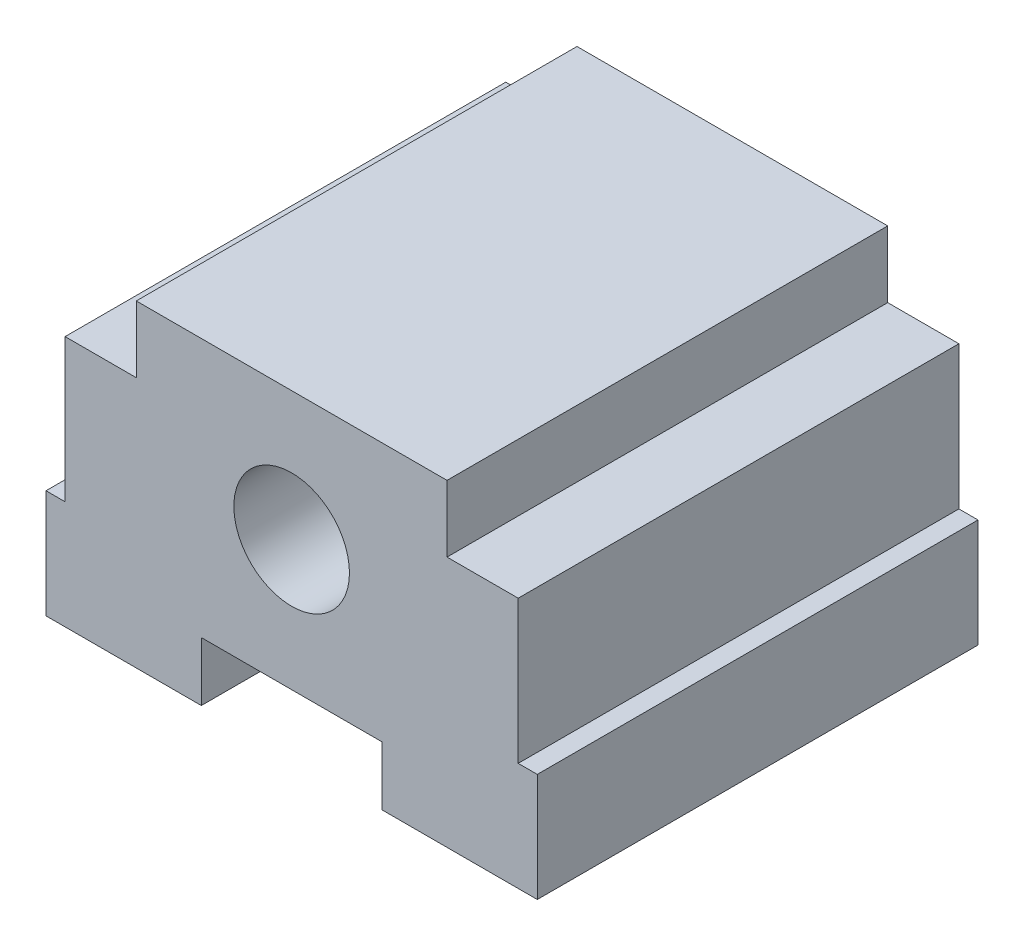
ISO-10303-21;
HEADER;
FILE_DESCRIPTION(('STEP AP214'),'2;1');
FILE_NAME('part.step','',(''),(''),'','','');
FILE_SCHEMA(('AUTOMOTIVE_DESIGN { 1 0 10303 214 1 1 1 1 }'));
ENDSEC;
DATA;
#1=APPLICATION_CONTEXT('core data for automotive mechanical design processes');
#2=APPLICATION_PROTOCOL_DEFINITION('international standard','automotive_design',2000,#1);
#3=PRODUCT_CONTEXT('',#1,'mechanical');
#4=PRODUCT('Part','Part','',(#3));
#5=PRODUCT_RELATED_PRODUCT_CATEGORY('part','',(#4));
#6=PRODUCT_DEFINITION_FORMATION('','',#4);
#7=PRODUCT_DEFINITION_CONTEXT('part definition',#1,'design');
#8=PRODUCT_DEFINITION('design','',#6,#7);
#9=PRODUCT_DEFINITION_SHAPE('','',#8);
#10=(LENGTH_UNIT() NAMED_UNIT(*) SI_UNIT(.MILLI.,.METRE.));
#11=(NAMED_UNIT(*) PLANE_ANGLE_UNIT() SI_UNIT($,.RADIAN.));
#12=(NAMED_UNIT(*) SI_UNIT($,.STERADIAN.) SOLID_ANGLE_UNIT());
#13=UNCERTAINTY_MEASURE_WITH_UNIT(LENGTH_MEASURE(1.E-05),#10,'distance_accuracy_value','');
#14=(GEOMETRIC_REPRESENTATION_CONTEXT(3) GLOBAL_UNCERTAINTY_ASSIGNED_CONTEXT((#13)) GLOBAL_UNIT_ASSIGNED_CONTEXT((#10,
#11,#12)) REPRESENTATION_CONTEXT('',''));
#15=CARTESIAN_POINT('',(0.,0.,0.));
#16=DIRECTION('',(0.,0.,1.));
#17=DIRECTION('',(1.,0.,0.));
#18=AXIS2_PLACEMENT_3D('',#15,#16,#17);
#19=CARTESIAN_POINT('',(-6.25,0.,30.5));
#20=DIRECTION('',(-1.,0.,0.));
#21=DIRECTION('',(0.,-1.,0.));
#22=AXIS2_PLACEMENT_3D('',#19,#20,#21);
#23=PLANE('',#22);
#24=DIRECTION('',(0.,1.,0.));
#25=VECTOR('',#24,1.);
#26=CARTESIAN_POINT('',(-6.25,0.,0.));
#27=LINE('',#26,#25);
#28=CARTESIAN_POINT('',(-6.25,-4.07597173144876,0.));
#29=VERTEX_POINT('',#28);
#30=CARTESIAN_POINT('',(-6.25,0.,0.));
#31=VERTEX_POINT('',#30);
#32=EDGE_CURVE('E177',#29,#31,#27,.T.);
#33=ORIENTED_EDGE('',*,*,#32,.T.);
#34=DIRECTION('',(0.,0.,-1.));
#35=VECTOR('',#34,1.);
#36=CARTESIAN_POINT('',(-6.25,0.,30.5));
#37=LINE('',#36,#35);
#38=CARTESIAN_POINT('',(-6.25,0.,30.5));
#39=VERTEX_POINT('',#38);
#40=EDGE_CURVE('E11',#39,#31,#37,.T.);
#41=ORIENTED_EDGE('',*,*,#40,.F.);
#42=DIRECTION('',(0.,1.,0.));
#43=VECTOR('',#42,1.);
#44=CARTESIAN_POINT('',(-6.25,0.,30.5));
#45=LINE('',#44,#43);
#46=CARTESIAN_POINT('',(-6.25,-4.07597173144876,30.5));
#47=VERTEX_POINT('',#46);
#48=EDGE_CURVE('E208',#47,#39,#45,.T.);
#49=ORIENTED_EDGE('',*,*,#48,.F.);
#50=DIRECTION('',(0.,0.,-1.));
#51=VECTOR('',#50,1.);
#52=CARTESIAN_POINT('',(-6.25,-4.07597173144876,30.5));
#53=LINE('',#52,#51);
#54=EDGE_CURVE('E173',#47,#29,#53,.T.);
#55=ORIENTED_EDGE('',*,*,#54,.T.);
#56=EDGE_LOOP('',(#33,#41,#49,#55));
#57=FACE_BOUND('',#56,.T.);
#58=ADVANCED_FACE('F33',(#57),#23,.F.);
#59=CARTESIAN_POINT('',(6.25,0.,30.5));
#60=DIRECTION('',(0.,1.,0.));
#61=DIRECTION('',(0.,0.,1.));
#62=AXIS2_PLACEMENT_3D('',#59,#60,#61);
#63=PLANE('',#62);
#64=DIRECTION('',(1.,0.,0.));
#65=VECTOR('',#64,1.);
#66=CARTESIAN_POINT('',(6.25,0.,0.));
#67=LINE('',#66,#65);
#68=CARTESIAN_POINT('',(6.25,0.,0.));
#69=VERTEX_POINT('',#68);
#70=EDGE_CURVE('E180',#31,#69,#67,.T.);
#71=ORIENTED_EDGE('',*,*,#70,.T.);
#72=DIRECTION('',(0.,0.,-1.));
#73=VECTOR('',#72,1.);
#74=CARTESIAN_POINT('',(6.25,0.,30.5));
#75=LINE('',#74,#73);
#76=CARTESIAN_POINT('',(6.25,0.,30.5));
#77=VERTEX_POINT('',#76);
#78=EDGE_CURVE('E41',#77,#69,#75,.T.);
#79=ORIENTED_EDGE('',*,*,#78,.F.);
#80=DIRECTION('',(1.,0.,0.));
#81=VECTOR('',#80,1.);
#82=CARTESIAN_POINT('',(6.25,0.,30.5));
#83=LINE('',#82,#81);
#84=EDGE_CURVE('E116',#39,#77,#83,.T.);
#85=ORIENTED_EDGE('',*,*,#84,.F.);
#86=ORIENTED_EDGE('',*,*,#40,.T.);
#87=EDGE_LOOP('',(#71,#79,#85,#86));
#88=FACE_BOUND('',#87,.T.);
#89=ADVANCED_FACE('F307',(#88),#63,.F.);
#90=CARTESIAN_POINT('',(6.25,0.,30.5));
#91=DIRECTION('',(1.,0.,0.));
#92=DIRECTION('',(0.,1.,0.));
#93=AXIS2_PLACEMENT_3D('',#90,#91,#92);
#94=PLANE('',#93);
#95=DIRECTION('',(0.,-1.,0.));
#96=VECTOR('',#95,1.);
#97=CARTESIAN_POINT('',(6.25,0.,0.));
#98=LINE('',#97,#96);
#99=CARTESIAN_POINT('',(6.25,-4.07597173144876,0.));
#100=VERTEX_POINT('',#99);
#101=EDGE_CURVE('E183',#69,#100,#98,.T.);
#102=ORIENTED_EDGE('',*,*,#101,.T.);
#103=DIRECTION('',(0.,0.,-1.));
#104=VECTOR('',#103,1.);
#105=CARTESIAN_POINT('',(6.25,-4.07597173144876,30.5));
#106=LINE('',#105,#104);
#107=CARTESIAN_POINT('',(6.25,-4.07597173144876,30.5));
#108=VERTEX_POINT('',#107);
#109=EDGE_CURVE('E239',#108,#100,#106,.T.);
#110=ORIENTED_EDGE('',*,*,#109,.F.);
#111=DIRECTION('',(0.,-1.,0.));
#112=VECTOR('',#111,1.);
#113=CARTESIAN_POINT('',(6.25,0.,30.5));
#114=LINE('',#113,#112);
#115=EDGE_CURVE('E247',#77,#108,#114,.T.);
#116=ORIENTED_EDGE('',*,*,#115,.F.);
#117=ORIENTED_EDGE('',*,*,#78,.T.);
#118=EDGE_LOOP('',(#102,#110,#116,#117));
#119=FACE_BOUND('',#118,.T.);
#120=ADVANCED_FACE('F245',(#119),#94,.F.);
#121=CARTESIAN_POINT('',(6.25,-4.07597173144876,30.5));
#122=DIRECTION('',(0.,1.,0.));
#123=DIRECTION('',(-1.,0.,0.));
#124=AXIS2_PLACEMENT_3D('',#121,#122,#123);
#125=PLANE('',#124);
#126=DIRECTION('',(1.,0.,0.));
#127=VECTOR('',#126,1.);
#128=CARTESIAN_POINT('',(6.25,-4.07597173144876,0.));
#129=LINE('',#128,#127);
#130=CARTESIAN_POINT('',(17.,-4.07597173144877,0.));
#131=VERTEX_POINT('',#130);
#132=EDGE_CURVE('E185',#100,#131,#129,.T.);
#133=ORIENTED_EDGE('',*,*,#132,.T.);
#134=DIRECTION('',(0.,0.,-1.));
#135=VECTOR('',#134,1.);
#136=CARTESIAN_POINT('',(17.,-4.07597173144877,30.5));
#137=LINE('',#136,#135);
#138=CARTESIAN_POINT('',(17.,-4.07597173144877,30.5));
#139=VERTEX_POINT('',#138);
#140=EDGE_CURVE('E236',#139,#131,#137,.T.);
#141=ORIENTED_EDGE('',*,*,#140,.F.);
#142=DIRECTION('',(1.,0.,0.));
#143=VECTOR('',#142,1.);
#144=CARTESIAN_POINT('',(6.25,-4.07597173144876,30.5));
#145=LINE('',#144,#143);
#146=EDGE_CURVE('E265',#108,#139,#145,.T.);
#147=ORIENTED_EDGE('',*,*,#146,.F.);
#148=ORIENTED_EDGE('',*,*,#109,.T.);
#149=EDGE_LOOP('',(#133,#141,#147,#148));
#150=FACE_BOUND('',#149,.T.);
#151=ADVANCED_FACE('F256',(#150),#125,.F.);
#152=CARTESIAN_POINT('',(17.,-4.07597173144877,30.5));
#153=DIRECTION('',(-1.,0.,0.));
#154=DIRECTION('',(0.,0.,1.));
#155=AXIS2_PLACEMENT_3D('',#152,#153,#154);
#156=PLANE('',#155);
#157=DIRECTION('',(0.,1.,0.));
#158=VECTOR('',#157,1.);
#159=CARTESIAN_POINT('',(17.,-4.07597173144877,0.));
#160=LINE('',#159,#158);
#161=CARTESIAN_POINT('',(17.,3.42402826855123,0.));
#162=VERTEX_POINT('',#161);
#163=EDGE_CURVE('E187',#131,#162,#160,.T.);
#164=ORIENTED_EDGE('',*,*,#163,.T.);
#165=DIRECTION('',(0.,0.,-1.));
#166=VECTOR('',#165,1.);
#167=CARTESIAN_POINT('',(17.,3.42402826855123,30.5));
#168=LINE('',#167,#166);
#169=CARTESIAN_POINT('',(17.,3.42402826855123,30.5));
#170=VERTEX_POINT('',#169);
#171=EDGE_CURVE('E233',#170,#162,#168,.T.);
#172=ORIENTED_EDGE('',*,*,#171,.F.);
#173=DIRECTION('',(0.,1.,0.));
#174=VECTOR('',#173,1.);
#175=CARTESIAN_POINT('',(17.,-4.07597173144877,30.5));
#176=LINE('',#175,#174);
#177=EDGE_CURVE('E262',#139,#170,#176,.T.);
#178=ORIENTED_EDGE('',*,*,#177,.F.);
#179=ORIENTED_EDGE('',*,*,#140,.T.);
#180=EDGE_LOOP('',(#164,#172,#178,#179));
#181=FACE_BOUND('',#180,.T.);
#182=ADVANCED_FACE('F260',(#181),#156,.F.);
#183=CARTESIAN_POINT('',(17.,3.42402826855123,30.5));
#184=DIRECTION('',(0.,-1.,0.));
#185=DIRECTION('',(0.,0.,-1.));
#186=AXIS2_PLACEMENT_3D('',#183,#184,#185);
#187=PLANE('',#186);
#188=DIRECTION('',(-1.,0.,0.));
#189=VECTOR('',#188,1.);
#190=CARTESIAN_POINT('',(17.,3.42402826855123,0.));
#191=LINE('',#190,#189);
#192=CARTESIAN_POINT('',(15.678445229682,3.42402826855123,0.));
#193=VERTEX_POINT('',#192);
#194=EDGE_CURVE('E189',#162,#193,#191,.T.);
#195=ORIENTED_EDGE('',*,*,#194,.T.);
#196=DIRECTION('',(0.,0.,-1.));
#197=VECTOR('',#196,1.);
#198=CARTESIAN_POINT('',(15.678445229682,3.42402826855123,30.5));
#199=LINE('',#198,#197);
#200=CARTESIAN_POINT('',(15.678445229682,3.42402826855123,30.5));
#201=VERTEX_POINT('',#200);
#202=EDGE_CURVE('E230',#201,#193,#199,.T.);
#203=ORIENTED_EDGE('',*,*,#202,.F.);
#204=DIRECTION('',(-1.,0.,0.));
#205=VECTOR('',#204,1.);
#206=CARTESIAN_POINT('',(17.,3.42402826855123,30.5));
#207=LINE('',#206,#205);
#208=EDGE_CURVE('E264',#170,#201,#207,.T.);
#209=ORIENTED_EDGE('',*,*,#208,.F.);
#210=ORIENTED_EDGE('',*,*,#171,.T.);
#211=EDGE_LOOP('',(#195,#203,#209,#210));
#212=FACE_BOUND('',#211,.T.);
#213=ADVANCED_FACE('F320',(#212),#187,.F.);
#214=CARTESIAN_POINT('',(15.678445229682,3.42402826855123,30.5));
#215=DIRECTION('',(-1.,0.,0.));
#216=DIRECTION('',(0.,0.,1.));
#217=AXIS2_PLACEMENT_3D('',#214,#215,#216);
#218=PLANE('',#217);
#219=DIRECTION('',(0.,1.,0.));
#220=VECTOR('',#219,1.);
#221=CARTESIAN_POINT('',(15.678445229682,3.42402826855123,0.));
#222=LINE('',#221,#220);
#223=CARTESIAN_POINT('',(15.678445229682,13.3240282685512,0.));
#224=VERTEX_POINT('',#223);
#225=EDGE_CURVE('E191',#193,#224,#222,.T.);
#226=ORIENTED_EDGE('',*,*,#225,.T.);
#227=DIRECTION('',(0.,0.,-1.));
#228=VECTOR('',#227,1.);
#229=CARTESIAN_POINT('',(15.678445229682,13.3240282685512,30.5));
#230=LINE('',#229,#228);
#231=CARTESIAN_POINT('',(15.678445229682,13.3240282685512,30.5));
#232=VERTEX_POINT('',#231);
#233=EDGE_CURVE('E227',#232,#224,#230,.T.);
#234=ORIENTED_EDGE('',*,*,#233,.F.);
#235=DIRECTION('',(0.,1.,0.));
#236=VECTOR('',#235,1.);
#237=CARTESIAN_POINT('',(15.678445229682,3.42402826855123,30.5));
#238=LINE('',#237,#236);
#239=EDGE_CURVE('E267',#201,#232,#238,.T.);
#240=ORIENTED_EDGE('',*,*,#239,.F.);
#241=ORIENTED_EDGE('',*,*,#202,.T.);
#242=EDGE_LOOP('',(#226,#234,#240,#241));
#243=FACE_BOUND('',#242,.T.);
#244=ADVANCED_FACE('F323',(#243),#218,.F.);
#245=CARTESIAN_POINT('',(15.678445229682,13.3240282685512,30.5));
#246=DIRECTION('',(0.,-1.,0.));
#247=DIRECTION('',(0.,0.,-1.));
#248=AXIS2_PLACEMENT_3D('',#245,#246,#247);
#249=PLANE('',#248);
#250=DIRECTION('',(-1.,0.,0.));
#251=VECTOR('',#250,1.);
#252=CARTESIAN_POINT('',(15.678445229682,13.3240282685512,0.));
#253=LINE('',#252,#251);
#254=CARTESIAN_POINT('',(10.7526501766785,13.3240282685512,0.));
#255=VERTEX_POINT('',#254);
#256=EDGE_CURVE('E193',#224,#255,#253,.T.);
#257=ORIENTED_EDGE('',*,*,#256,.T.);
#258=DIRECTION('',(0.,0.,-1.));
#259=VECTOR('',#258,1.);
#260=CARTESIAN_POINT('',(10.7526501766785,13.3240282685512,30.5));
#261=LINE('',#260,#259);
#262=CARTESIAN_POINT('',(10.7526501766785,13.3240282685512,30.5));
#263=VERTEX_POINT('',#262);
#264=EDGE_CURVE('E224',#263,#255,#261,.T.);
#265=ORIENTED_EDGE('',*,*,#264,.F.);
#266=DIRECTION('',(-1.,0.,0.));
#267=VECTOR('',#266,1.);
#268=CARTESIAN_POINT('',(15.678445229682,13.3240282685512,30.5));
#269=LINE('',#268,#267);
#270=EDGE_CURVE('E273',#232,#263,#269,.T.);
#271=ORIENTED_EDGE('',*,*,#270,.F.);
#272=ORIENTED_EDGE('',*,*,#233,.T.);
#273=EDGE_LOOP('',(#257,#265,#271,#272));
#274=FACE_BOUND('',#273,.T.);
#275=ADVANCED_FACE('F327',(#274),#249,.F.);
#276=CARTESIAN_POINT('',(10.7526501766785,13.3240282685512,30.5));
#277=DIRECTION('',(-1.,0.,0.));
#278=DIRECTION('',(0.,0.,1.));
#279=AXIS2_PLACEMENT_3D('',#276,#277,#278);
#280=PLANE('',#279);
#281=DIRECTION('',(0.,1.,0.));
#282=VECTOR('',#281,1.);
#283=CARTESIAN_POINT('',(10.7526501766785,13.3240282685512,0.));
#284=LINE('',#283,#282);
#285=CARTESIAN_POINT('',(10.7526501766785,17.9240282685512,0.));
#286=VERTEX_POINT('',#285);
#287=EDGE_CURVE('E195',#255,#286,#284,.T.);
#288=ORIENTED_EDGE('',*,*,#287,.T.);
#289=DIRECTION('',(0.,0.,-1.));
#290=VECTOR('',#289,1.);
#291=CARTESIAN_POINT('',(10.7526501766785,17.9240282685512,30.5));
#292=LINE('',#291,#290);
#293=CARTESIAN_POINT('',(10.7526501766785,17.9240282685512,30.5));
#294=VERTEX_POINT('',#293);
#295=EDGE_CURVE('E221',#294,#286,#292,.T.);
#296=ORIENTED_EDGE('',*,*,#295,.F.);
#297=DIRECTION('',(0.,1.,0.));
#298=VECTOR('',#297,1.);
#299=CARTESIAN_POINT('',(10.7526501766785,13.3240282685512,30.5));
#300=LINE('',#299,#298);
#301=EDGE_CURVE('E275',#263,#294,#300,.T.);
#302=ORIENTED_EDGE('',*,*,#301,.F.);
#303=ORIENTED_EDGE('',*,*,#264,.T.);
#304=EDGE_LOOP('',(#288,#296,#302,#303));
#305=FACE_BOUND('',#304,.T.);
#306=ADVANCED_FACE('F331',(#305),#280,.F.);
#307=CARTESIAN_POINT('',(-10.7526501766785,17.9240282685512,30.5));
#308=DIRECTION('',(0.,-1.,0.));
#309=DIRECTION('',(0.,0.,-1.));
#310=AXIS2_PLACEMENT_3D('',#307,#308,#309);
#311=PLANE('',#310);
#312=DIRECTION('',(-1.,0.,0.));
#313=VECTOR('',#312,1.);
#314=CARTESIAN_POINT('',(-10.7526501766785,17.9240282685512,0.));
#315=LINE('',#314,#313);
#316=CARTESIAN_POINT('',(-10.7526501766785,17.9240282685512,0.));
#317=VERTEX_POINT('',#316);
#318=EDGE_CURVE('E197',#286,#317,#315,.T.);
#319=ORIENTED_EDGE('',*,*,#318,.T.);
#320=DIRECTION('',(0.,0.,-1.));
#321=VECTOR('',#320,1.);
#322=CARTESIAN_POINT('',(-10.7526501766785,17.9240282685512,30.5));
#323=LINE('',#322,#321);
#324=CARTESIAN_POINT('',(-10.7526501766785,17.9240282685512,30.5));
#325=VERTEX_POINT('',#324);
#326=EDGE_CURVE('E218',#325,#317,#323,.T.);
#327=ORIENTED_EDGE('',*,*,#326,.F.);
#328=DIRECTION('',(-1.,0.,0.));
#329=VECTOR('',#328,1.);
#330=CARTESIAN_POINT('',(-10.7526501766785,17.9240282685512,30.5));
#331=LINE('',#330,#329);
#332=EDGE_CURVE('E277',#294,#325,#331,.T.);
#333=ORIENTED_EDGE('',*,*,#332,.F.);
#334=ORIENTED_EDGE('',*,*,#295,.T.);
#335=EDGE_LOOP('',(#319,#327,#333,#334));
#336=FACE_BOUND('',#335,.T.);
#337=ADVANCED_FACE('F335',(#336),#311,.F.);
#338=CARTESIAN_POINT('',(-10.7526501766785,13.3240282685512,30.5));
#339=DIRECTION('',(1.,0.,0.));
#340=DIRECTION('',(0.,0.,-1.));
#341=AXIS2_PLACEMENT_3D('',#338,#339,#340);
#342=PLANE('',#341);
#343=DIRECTION('',(0.,-1.,0.));
#344=VECTOR('',#343,1.);
#345=CARTESIAN_POINT('',(-10.7526501766785,13.3240282685512,0.));
#346=LINE('',#345,#344);
#347=CARTESIAN_POINT('',(-10.7526501766785,13.3240282685512,0.));
#348=VERTEX_POINT('',#347);
#349=EDGE_CURVE('E199',#317,#348,#346,.T.);
#350=ORIENTED_EDGE('',*,*,#349,.T.);
#351=DIRECTION('',(0.,0.,-1.));
#352=VECTOR('',#351,1.);
#353=CARTESIAN_POINT('',(-10.7526501766785,13.3240282685512,30.5));
#354=LINE('',#353,#352);
#355=CARTESIAN_POINT('',(-10.7526501766785,13.3240282685512,30.5));
#356=VERTEX_POINT('',#355);
#357=EDGE_CURVE('E215',#356,#348,#354,.T.);
#358=ORIENTED_EDGE('',*,*,#357,.F.);
#359=DIRECTION('',(0.,-1.,0.));
#360=VECTOR('',#359,1.);
#361=CARTESIAN_POINT('',(-10.7526501766785,13.3240282685512,30.5));
#362=LINE('',#361,#360);
#363=EDGE_CURVE('E279',#325,#356,#362,.T.);
#364=ORIENTED_EDGE('',*,*,#363,.F.);
#365=ORIENTED_EDGE('',*,*,#326,.T.);
#366=EDGE_LOOP('',(#350,#358,#364,#365));
#367=FACE_BOUND('',#366,.T.);
#368=ADVANCED_FACE('F339',(#367),#342,.F.);
#369=CARTESIAN_POINT('',(-15.678445229682,13.3240282685512,30.5));
#370=DIRECTION('',(0.,-1.,0.));
#371=DIRECTION('',(0.,0.,-1.));
#372=AXIS2_PLACEMENT_3D('',#369,#370,#371);
#373=PLANE('',#372);
#374=DIRECTION('',(-1.,0.,0.));
#375=VECTOR('',#374,1.);
#376=CARTESIAN_POINT('',(-15.678445229682,13.3240282685512,0.));
#377=LINE('',#376,#375);
#378=CARTESIAN_POINT('',(-15.678445229682,13.3240282685512,0.));
#379=VERTEX_POINT('',#378);
#380=EDGE_CURVE('E201',#348,#379,#377,.T.);
#381=ORIENTED_EDGE('',*,*,#380,.T.);
#382=DIRECTION('',(0.,0.,-1.));
#383=VECTOR('',#382,1.);
#384=CARTESIAN_POINT('',(-15.678445229682,13.3240282685512,30.5));
#385=LINE('',#384,#383);
#386=CARTESIAN_POINT('',(-15.678445229682,13.3240282685512,30.5));
#387=VERTEX_POINT('',#386);
#388=EDGE_CURVE('E212',#387,#379,#385,.T.);
#389=ORIENTED_EDGE('',*,*,#388,.F.);
#390=DIRECTION('',(-1.,0.,0.));
#391=VECTOR('',#390,1.);
#392=CARTESIAN_POINT('',(-15.678445229682,13.3240282685512,30.5));
#393=LINE('',#392,#391);
#394=EDGE_CURVE('E281',#356,#387,#393,.T.);
#395=ORIENTED_EDGE('',*,*,#394,.F.);
#396=ORIENTED_EDGE('',*,*,#357,.T.);
#397=EDGE_LOOP('',(#381,#389,#395,#396));
#398=FACE_BOUND('',#397,.T.);
#399=ADVANCED_FACE('F287',(#398),#373,.F.);
#400=CARTESIAN_POINT('',(-15.678445229682,3.42402826855123,30.5));
#401=DIRECTION('',(1.,0.,0.));
#402=DIRECTION('',(0.,0.,-1.));
#403=AXIS2_PLACEMENT_3D('',#400,#401,#402);
#404=PLANE('',#403);
#405=DIRECTION('',(0.,-1.,0.));
#406=VECTOR('',#405,1.);
#407=CARTESIAN_POINT('',(-15.678445229682,3.42402826855123,0.));
#408=LINE('',#407,#406);
#409=CARTESIAN_POINT('',(-15.678445229682,3.42402826855123,0.));
#410=VERTEX_POINT('',#409);
#411=EDGE_CURVE('E203',#379,#410,#408,.T.);
#412=ORIENTED_EDGE('',*,*,#411,.T.);
#413=DIRECTION('',(0.,0.,-1.));
#414=VECTOR('',#413,1.);
#415=CARTESIAN_POINT('',(-15.678445229682,3.42402826855123,30.5));
#416=LINE('',#415,#414);
#417=CARTESIAN_POINT('',(-15.678445229682,3.42402826855123,30.5));
#418=VERTEX_POINT('',#417);
#419=EDGE_CURVE('E168',#418,#410,#416,.T.);
#420=ORIENTED_EDGE('',*,*,#419,.F.);
#421=DIRECTION('',(0.,-1.,0.));
#422=VECTOR('',#421,1.);
#423=CARTESIAN_POINT('',(-15.678445229682,3.42402826855123,30.5));
#424=LINE('',#423,#422);
#425=EDGE_CURVE('E159',#387,#418,#424,.T.);
#426=ORIENTED_EDGE('',*,*,#425,.F.);
#427=ORIENTED_EDGE('',*,*,#388,.T.);
#428=EDGE_LOOP('',(#412,#420,#426,#427));
#429=FACE_BOUND('',#428,.T.);
#430=ADVANCED_FACE('F291',(#429),#404,.F.);
#431=CARTESIAN_POINT('',(-17.,3.42402826855123,30.5));
#432=DIRECTION('',(0.,-1.,0.));
#433=DIRECTION('',(0.,0.,-1.));
#434=AXIS2_PLACEMENT_3D('',#431,#432,#433);
#435=PLANE('',#434);
#436=DIRECTION('',(-1.,0.,0.));
#437=VECTOR('',#436,1.);
#438=CARTESIAN_POINT('',(-17.,3.42402826855123,0.));
#439=LINE('',#438,#437);
#440=CARTESIAN_POINT('',(-17.,3.42402826855123,0.));
#441=VERTEX_POINT('',#440);
#442=EDGE_CURVE('E167',#410,#441,#439,.T.);
#443=ORIENTED_EDGE('',*,*,#442,.T.);
#444=DIRECTION('',(0.,0.,-1.));
#445=VECTOR('',#444,1.);
#446=CARTESIAN_POINT('',(-17.,3.42402826855123,30.5));
#447=LINE('',#446,#445);
#448=CARTESIAN_POINT('',(-17.,3.42402826855123,30.5));
#449=VERTEX_POINT('',#448);
#450=EDGE_CURVE('E164',#449,#441,#447,.T.);
#451=ORIENTED_EDGE('',*,*,#450,.F.);
#452=DIRECTION('',(-1.,0.,0.));
#453=VECTOR('',#452,1.);
#454=CARTESIAN_POINT('',(-17.,3.42402826855123,30.5));
#455=LINE('',#454,#453);
#456=EDGE_CURVE('E153',#418,#449,#455,.T.);
#457=ORIENTED_EDGE('',*,*,#456,.F.);
#458=ORIENTED_EDGE('',*,*,#419,.T.);
#459=EDGE_LOOP('',(#443,#451,#457,#458));
#460=FACE_BOUND('',#459,.T.);
#461=ADVANCED_FACE('F165',(#460),#435,.F.);
#462=CARTESIAN_POINT('',(-17.,-4.07597173144877,30.5));
#463=DIRECTION('',(1.,0.,0.));
#464=DIRECTION('',(0.,0.,-1.));
#465=AXIS2_PLACEMENT_3D('',#462,#463,#464);
#466=PLANE('',#465);
#467=DIRECTION('',(0.,-1.,0.));
#468=VECTOR('',#467,1.);
#469=CARTESIAN_POINT('',(-17.,-4.07597173144877,0.));
#470=LINE('',#469,#468);
#471=CARTESIAN_POINT('',(-17.,-4.07597173144877,0.));
#472=VERTEX_POINT('',#471);
#473=EDGE_CURVE('E102',#441,#472,#470,.T.);
#474=ORIENTED_EDGE('',*,*,#473,.T.);
#475=DIRECTION('',(0.,0.,-1.));
#476=VECTOR('',#475,1.);
#477=CARTESIAN_POINT('',(-17.,-4.07597173144877,30.5));
#478=LINE('',#477,#476);
#479=CARTESIAN_POINT('',(-17.,-4.07597173144877,30.5));
#480=VERTEX_POINT('',#479);
#481=EDGE_CURVE('E169',#480,#472,#478,.T.);
#482=ORIENTED_EDGE('',*,*,#481,.F.);
#483=DIRECTION('',(0.,-1.,0.));
#484=VECTOR('',#483,1.);
#485=CARTESIAN_POINT('',(-17.,-4.07597173144877,30.5));
#486=LINE('',#485,#484);
#487=EDGE_CURVE('E157',#449,#480,#486,.T.);
#488=ORIENTED_EDGE('',*,*,#487,.F.);
#489=ORIENTED_EDGE('',*,*,#450,.T.);
#490=EDGE_LOOP('',(#474,#482,#488,#489));
#491=FACE_BOUND('',#490,.T.);
#492=ADVANCED_FACE('F171',(#491),#466,.F.);
#493=CARTESIAN_POINT('',(-6.25,-4.07597173144876,30.5));
#494=DIRECTION('',(0.,1.,0.));
#495=DIRECTION('',(-1.,0.,0.));
#496=AXIS2_PLACEMENT_3D('',#493,#494,#495);
#497=PLANE('',#496);
#498=DIRECTION('',(1.,0.,0.));
#499=VECTOR('',#498,1.);
#500=CARTESIAN_POINT('',(-6.25,-4.07597173144876,0.));
#501=LINE('',#500,#499);
#502=EDGE_CURVE('E108',#472,#29,#501,.T.);
#503=ORIENTED_EDGE('',*,*,#502,.T.);
#504=ORIENTED_EDGE('',*,*,#54,.F.);
#505=DIRECTION('',(1.,0.,0.));
#506=VECTOR('',#505,1.);
#507=CARTESIAN_POINT('',(-6.25,-4.07597173144876,30.5));
#508=LINE('',#507,#506);
#509=EDGE_CURVE('E49',#480,#47,#508,.T.);
#510=ORIENTED_EDGE('',*,*,#509,.F.);
#511=ORIENTED_EDGE('',*,*,#481,.T.);
#512=EDGE_LOOP('',(#503,#504,#510,#511));
#513=FACE_BOUND('',#512,.T.);
#514=ADVANCED_FACE('F295',(#513),#497,.F.);
#515=CARTESIAN_POINT('',(0.,0.,30.5));
#516=DIRECTION('',(0.,0.,-1.));
#517=DIRECTION('',(-1.,0.,0.));
#518=AXIS2_PLACEMENT_3D('',#515,#516,#517);
#519=PLANE('',#518);
#520=CARTESIAN_POINT('',(0.,8.99841861307005,30.5));
#521=DIRECTION('',(0.,0.,1.));
#522=DIRECTION('',(1.,0.,0.));
#523=AXIS2_PLACEMENT_3D('',#520,#521,#522);
#524=CIRCLE('',#523,4.);
#525=CARTESIAN_POINT('',(4.,8.99841861307005,30.5));
#526=VERTEX_POINT('',#525);
#527=EDGE_CURVE('E394',#526,#526,#524,.T.);
#528=ORIENTED_EDGE('',*,*,#527,.F.);
#529=EDGE_LOOP('',(#528));
#530=FACE_BOUND('',#529,.T.);
#531=ORIENTED_EDGE('',*,*,#48,.T.);
#532=ORIENTED_EDGE('',*,*,#84,.T.);
#533=ORIENTED_EDGE('',*,*,#115,.T.);
#534=ORIENTED_EDGE('',*,*,#146,.T.);
#535=ORIENTED_EDGE('',*,*,#177,.T.);
#536=ORIENTED_EDGE('',*,*,#208,.T.);
#537=ORIENTED_EDGE('',*,*,#239,.T.);
#538=ORIENTED_EDGE('',*,*,#270,.T.);
#539=ORIENTED_EDGE('',*,*,#301,.T.);
#540=ORIENTED_EDGE('',*,*,#332,.T.);
#541=ORIENTED_EDGE('',*,*,#363,.T.);
#542=ORIENTED_EDGE('',*,*,#394,.T.);
#543=ORIENTED_EDGE('',*,*,#425,.T.);
#544=ORIENTED_EDGE('',*,*,#456,.T.);
#545=ORIENTED_EDGE('',*,*,#487,.T.);
#546=ORIENTED_EDGE('',*,*,#509,.T.);
#547=EDGE_LOOP('',(#531,#532,#533,#534,#535,#536,#537,#538,#539,#540,#541,#542,#543,#544,#545,#546));
#548=FACE_BOUND('',#547,.T.);
#549=ADVANCED_FACE('F155',(#530,#548),#519,.F.);
#550=CARTESIAN_POINT('',(0.,0.,0.));
#551=DIRECTION('',(0.,0.,-1.));
#552=DIRECTION('',(-1.,0.,0.));
#553=AXIS2_PLACEMENT_3D('',#550,#551,#552);
#554=PLANE('',#553);
#555=CARTESIAN_POINT('',(0.,8.99841861307005,0.));
#556=DIRECTION('',(0.,0.,1.));
#557=DIRECTION('',(1.,0.,0.));
#558=AXIS2_PLACEMENT_3D('',#555,#556,#557);
#559=CIRCLE('',#558,4.);
#560=CARTESIAN_POINT('',(4.,8.99841861307005,0.));
#561=VERTEX_POINT('',#560);
#562=EDGE_CURVE('E181',#561,#561,#559,.T.);
#563=ORIENTED_EDGE('',*,*,#562,.T.);
#564=EDGE_LOOP('',(#563));
#565=FACE_BOUND('',#564,.T.);
#566=ORIENTED_EDGE('',*,*,#32,.F.);
#567=ORIENTED_EDGE('',*,*,#502,.F.);
#568=ORIENTED_EDGE('',*,*,#473,.F.);
#569=ORIENTED_EDGE('',*,*,#442,.F.);
#570=ORIENTED_EDGE('',*,*,#411,.F.);
#571=ORIENTED_EDGE('',*,*,#380,.F.);
#572=ORIENTED_EDGE('',*,*,#349,.F.);
#573=ORIENTED_EDGE('',*,*,#318,.F.);
#574=ORIENTED_EDGE('',*,*,#287,.F.);
#575=ORIENTED_EDGE('',*,*,#256,.F.);
#576=ORIENTED_EDGE('',*,*,#225,.F.);
#577=ORIENTED_EDGE('',*,*,#194,.F.);
#578=ORIENTED_EDGE('',*,*,#163,.F.);
#579=ORIENTED_EDGE('',*,*,#132,.F.);
#580=ORIENTED_EDGE('',*,*,#101,.F.);
#581=ORIENTED_EDGE('',*,*,#70,.F.);
#582=EDGE_LOOP('',(#566,#567,#568,#569,#570,#571,#572,#573,#574,#575,#576,#577,#578,#579,#580,#581));
#583=FACE_BOUND('',#582,.T.);
#584=ADVANCED_FACE('F251',(#565,#583),#554,.T.);
#585=CARTESIAN_POINT('',(0.,8.99841861307005,0.));
#586=DIRECTION('',(0.,0.,1.));
#587=DIRECTION('',(1.,0.,0.));
#588=AXIS2_PLACEMENT_3D('',#585,#586,#587);
#589=CYLINDRICAL_SURFACE('',#588,4.);
#590=CARTESIAN_POINT('',(4.,8.99841861307005,0.));
#591=CARTESIAN_POINT('',(4.,8.99841861307005,0.317708333333333));
#592=CARTESIAN_POINT('',(4.,8.99841861307005,0.635416666666667));
#593=CARTESIAN_POINT('',(4.,8.99841861307005,1.27083333333333));
#594=CARTESIAN_POINT('',(4.,8.99841861307005,1.58854166666667));
#595=CARTESIAN_POINT('',(4.,8.99841861307005,2.22395833333333));
#596=CARTESIAN_POINT('',(4.,8.99841861307005,2.54166666666667));
#597=CARTESIAN_POINT('',(4.,8.99841861307005,3.17708333333333));
#598=CARTESIAN_POINT('',(4.,8.99841861307005,3.49479166666667));
#599=CARTESIAN_POINT('',(4.,8.99841861307005,4.13020833333333));
#600=CARTESIAN_POINT('',(4.,8.99841861307005,4.44791666666667));
#601=CARTESIAN_POINT('',(4.,8.99841861307005,5.08333333333333));
#602=CARTESIAN_POINT('',(4.,8.99841861307005,5.40104166666667));
#603=CARTESIAN_POINT('',(4.,8.99841861307005,6.03645833333333));
#604=CARTESIAN_POINT('',(4.,8.99841861307005,6.35416666666667));
#605=CARTESIAN_POINT('',(4.,8.99841861307005,6.98958333333333));
#606=CARTESIAN_POINT('',(4.,8.99841861307005,7.30729166666667));
#607=CARTESIAN_POINT('',(4.,8.99841861307005,7.94270833333333));
#608=CARTESIAN_POINT('',(4.,8.99841861307005,8.26041666666666));
#609=CARTESIAN_POINT('',(4.,8.99841861307005,8.89583333333333));
#610=CARTESIAN_POINT('',(4.,8.99841861307005,9.21354166666666));
#611=CARTESIAN_POINT('',(4.,8.99841861307005,9.84895833333333));
#612=CARTESIAN_POINT('',(4.,8.99841861307005,10.1666666666667));
#613=CARTESIAN_POINT('',(4.,8.99841861307005,10.8020833333333));
#614=CARTESIAN_POINT('',(4.,8.99841861307005,11.1197916666667));
#615=CARTESIAN_POINT('',(4.,8.99841861307005,11.7552083333333));
#616=CARTESIAN_POINT('',(4.,8.99841861307005,12.0729166666667));
#617=CARTESIAN_POINT('',(4.,8.99841861307005,12.7083333333333));
#618=CARTESIAN_POINT('',(4.,8.99841861307005,13.0260416666667));
#619=CARTESIAN_POINT('',(4.,8.99841861307005,13.6614583333333));
#620=CARTESIAN_POINT('',(4.,8.99841861307005,13.9791666666667));
#621=CARTESIAN_POINT('',(4.,8.99841861307005,14.6145833333333));
#622=CARTESIAN_POINT('',(4.,8.99841861307005,14.9322916666667));
#623=CARTESIAN_POINT('',(4.,8.99841861307005,15.5677083333333));
#624=CARTESIAN_POINT('',(4.,8.99841861307005,15.8854166666667));
#625=CARTESIAN_POINT('',(4.,8.99841861307005,16.5208333333333));
#626=CARTESIAN_POINT('',(4.,8.99841861307005,16.8385416666667));
#627=CARTESIAN_POINT('',(4.,8.99841861307005,17.4739583333333));
#628=CARTESIAN_POINT('',(4.,8.99841861307005,17.7916666666667));
#629=CARTESIAN_POINT('',(4.,8.99841861307005,18.4270833333333));
#630=CARTESIAN_POINT('',(4.,8.99841861307005,18.7447916666667));
#631=CARTESIAN_POINT('',(4.,8.99841861307005,19.3802083333333));
#632=CARTESIAN_POINT('',(4.,8.99841861307005,19.6979166666667));
#633=CARTESIAN_POINT('',(4.,8.99841861307005,20.3333333333333));
#634=CARTESIAN_POINT('',(4.,8.99841861307005,20.6510416666667));
#635=CARTESIAN_POINT('',(4.,8.99841861307005,21.2864583333333));
#636=CARTESIAN_POINT('',(4.,8.99841861307005,21.6041666666667));
#637=CARTESIAN_POINT('',(4.,8.99841861307005,22.2395833333333));
#638=CARTESIAN_POINT('',(4.,8.99841861307005,22.5572916666667));
#639=CARTESIAN_POINT('',(4.,8.99841861307005,23.1927083333333));
#640=CARTESIAN_POINT('',(4.,8.99841861307005,23.5104166666667));
#641=CARTESIAN_POINT('',(4.,8.99841861307005,24.1458333333333));
#642=CARTESIAN_POINT('',(4.,8.99841861307005,24.4635416666667));
#643=CARTESIAN_POINT('',(4.,8.99841861307005,25.0989583333333));
#644=CARTESIAN_POINT('',(4.,8.99841861307005,25.4166666666667));
#645=CARTESIAN_POINT('',(4.,8.99841861307005,26.0520833333333));
#646=CARTESIAN_POINT('',(4.,8.99841861307005,26.3697916666667));
#647=CARTESIAN_POINT('',(4.,8.99841861307005,27.0052083333333));
#648=CARTESIAN_POINT('',(4.,8.99841861307005,27.3229166666667));
#649=CARTESIAN_POINT('',(4.,8.99841861307005,27.9583333333333));
#650=CARTESIAN_POINT('',(4.,8.99841861307005,28.2760416666667));
#651=CARTESIAN_POINT('',(4.,8.99841861307005,28.9114583333333));
#652=CARTESIAN_POINT('',(4.,8.99841861307005,29.2291666666667));
#653=CARTESIAN_POINT('',(4.,8.99841861307005,29.8645833333333));
#654=CARTESIAN_POINT('',(4.,8.99841861307005,30.1822916666667));
#655=CARTESIAN_POINT('',(4.,8.99841861307005,30.5));
#656=B_SPLINE_CURVE_WITH_KNOTS('',3,(#590,#591,#592,#593,#594,#595,#596,#597,#598,#599,#600,
#601,#602,#603,#604,#605,#606,#607,#608,#609,#610,#611,#612,#613,#614,#615,#616,#617,#618,#619,
#620,#621,#622,#623,#624,#625,#626,#627,#628,#629,#630,#631,#632,#633,#634,#635,#636,#637,#638,
#639,#640,#641,#642,#643,#644,#645,#646,#647,#648,#649,#650,#651,#652,#653,#654,#655),
.UNSPECIFIED.,.F.,.F.,(4,2,2,2,2,2,2,2,2,2,2,2,2,2,2,2,2,2,2,2,2,2,2,2,2,2,2,2,2,2,2,2,4),(0.,
0.953125,1.90625,2.859375,3.8125,4.765625,5.71875,6.671875,7.625,8.578125,9.53125,10.484375,
11.4375,12.390625,13.34375,14.296875,15.25,16.203125,17.15625,18.109375,19.0625,20.015625,
20.96875,21.921875,22.875,23.828125,24.78125,25.734375,26.6875,27.640625,28.59375,29.546875,
30.5),.UNSPECIFIED.);
#657=EDGE_CURVE('BSEAM376',#561,#526,#656,.T.);
#658=ORIENTED_EDGE('',*,*,#562,.F.);
#659=ORIENTED_EDGE('',*,*,#527,.T.);
#660=ORIENTED_EDGE('',*,*,#657,.T.);
#661=ORIENTED_EDGE('',*,*,#657,.F.);
#662=EDGE_LOOP('',(#658,#660,#659,#661));
#663=FACE_BOUND('',#662,.T.);
#664=ADVANCED_FACE('F376',(#663),#589,.F.);
#665=CLOSED_SHELL('',(#58,#89,#120,#151,#182,#213,#244,#275,#306,#337,#368,#399,#430,#461,#492,
#514,#549,#584,#664));
#666=MANIFOLD_SOLID_BREP('B2',#665);
#667=ADVANCED_BREP_SHAPE_REPRESENTATION('',(#18,#666),#14);
#668=SHAPE_DEFINITION_REPRESENTATION(#9,#667);
ENDSEC;
END-ISO-10303-21;
